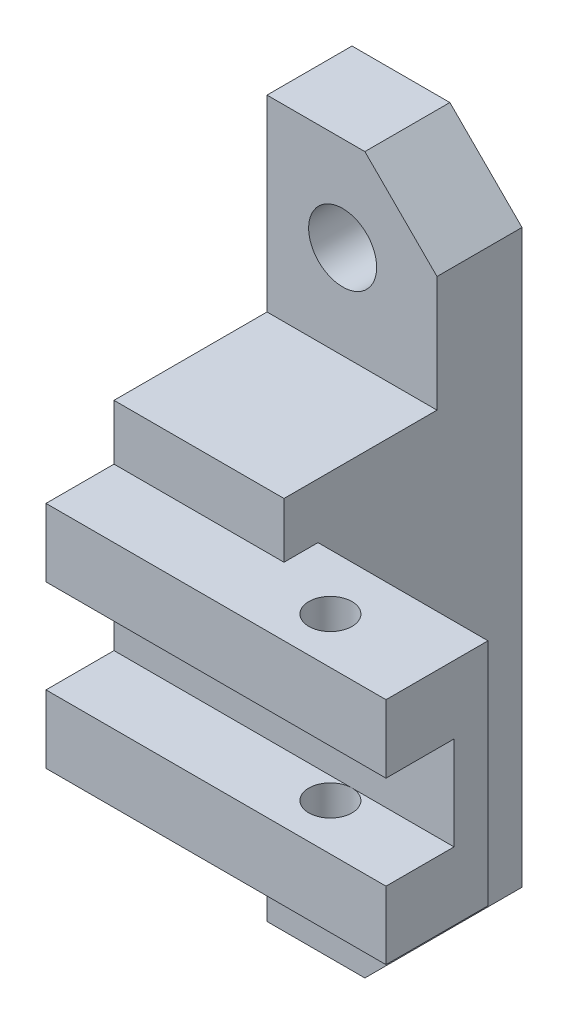
ISO-10303-21;
HEADER;
FILE_DESCRIPTION(('STEP AP214'),'2;1');
FILE_NAME('part.step','',(''),(''),'','','');
FILE_SCHEMA(('AUTOMOTIVE_DESIGN { 1 0 10303 214 1 1 1 1 }'));
ENDSEC;
DATA;
#1=APPLICATION_CONTEXT('core data for automotive mechanical design processes');
#2=APPLICATION_PROTOCOL_DEFINITION('international standard','automotive_design',2000,#1);
#3=PRODUCT_CONTEXT('',#1,'mechanical');
#4=PRODUCT('Part','Part','',(#3));
#5=PRODUCT_RELATED_PRODUCT_CATEGORY('part','',(#4));
#6=PRODUCT_DEFINITION_FORMATION('','',#4);
#7=PRODUCT_DEFINITION_CONTEXT('part definition',#1,'design');
#8=PRODUCT_DEFINITION('design','',#6,#7);
#9=PRODUCT_DEFINITION_SHAPE('','',#8);
#10=(LENGTH_UNIT() NAMED_UNIT(*) SI_UNIT(.MILLI.,.METRE.));
#11=(NAMED_UNIT(*) PLANE_ANGLE_UNIT() SI_UNIT($,.RADIAN.));
#12=(NAMED_UNIT(*) SI_UNIT($,.STERADIAN.) SOLID_ANGLE_UNIT());
#13=UNCERTAINTY_MEASURE_WITH_UNIT(LENGTH_MEASURE(1.E-05),#10,'distance_accuracy_value','');
#14=(GEOMETRIC_REPRESENTATION_CONTEXT(3) GLOBAL_UNCERTAINTY_ASSIGNED_CONTEXT((#13)) GLOBAL_UNIT_ASSIGNED_CONTEXT((#10,
#11,#12)) REPRESENTATION_CONTEXT('',''));
#15=CARTESIAN_POINT('',(0.,0.,0.));
#16=DIRECTION('',(0.,0.,1.));
#17=DIRECTION('',(1.,0.,0.));
#18=AXIS2_PLACEMENT_3D('',#15,#16,#17);
#19=CARTESIAN_POINT('',(21.05,0.,5.));
#20=DIRECTION('',(1.,0.,0.));
#21=DIRECTION('',(0.,1.,0.));
#22=AXIS2_PLACEMENT_3D('',#19,#20,#21);
#23=PLANE('',#22);
#24=DIRECTION('',(0.,1.,0.));
#25=VECTOR('',#24,1.);
#26=CARTESIAN_POINT('',(21.05,-6.75,12.));
#27=LINE('',#26,#25);
#28=CARTESIAN_POINT('',(21.05,-6.75,12.));
#29=VERTEX_POINT('',#28);
#30=CARTESIAN_POINT('',(21.05,6.75,12.));
#31=VERTEX_POINT('',#30);
#32=EDGE_CURVE('E199',#29,#31,#27,.T.);
#33=ORIENTED_EDGE('',*,*,#32,.F.);
#34=DIRECTION('',(0.,0.,1.));
#35=VECTOR('',#34,1.);
#36=CARTESIAN_POINT('',(21.05,-6.75,12.));
#37=LINE('',#36,#35);
#38=CARTESIAN_POINT('',(21.05,-6.75,14.));
#39=VERTEX_POINT('',#38);
#40=EDGE_CURVE('E196',#29,#39,#37,.T.);
#41=ORIENTED_EDGE('',*,*,#40,.T.);
#42=DIRECTION('',(0.,1.,0.));
#43=VECTOR('',#42,1.);
#44=CARTESIAN_POINT('',(21.05,10.,14.));
#45=LINE('',#44,#43);
#46=CARTESIAN_POINT('',(21.05,-10.,14.));
#47=VERTEX_POINT('',#46);
#48=EDGE_CURVE('E280',#47,#39,#45,.T.);
#49=ORIENTED_EDGE('',*,*,#48,.F.);
#50=DIRECTION('',(0.,0.,-1.));
#51=VECTOR('',#50,1.);
#52=CARTESIAN_POINT('',(21.05,-10.,46.3606797749979));
#53=LINE('',#52,#51);
#54=CARTESIAN_POINT('',(21.05,-10.,5.));
#55=VERTEX_POINT('',#54);
#56=EDGE_CURVE('E261',#47,#55,#53,.T.);
#57=ORIENTED_EDGE('',*,*,#56,.T.);
#58=DIRECTION('',(0.,-1.,0.));
#59=VECTOR('',#58,1.);
#60=CARTESIAN_POINT('',(21.05,0.,5.));
#61=LINE('',#60,#59);
#62=CARTESIAN_POINT('',(21.05,-16.8073593128807,5.));
#63=VERTEX_POINT('',#62);
#64=EDGE_CURVE('E301',#55,#63,#61,.T.);
#65=ORIENTED_EDGE('',*,*,#64,.T.);
#66=DIRECTION('',(0.,0.,-1.));
#67=VECTOR('',#66,1.);
#68=CARTESIAN_POINT('',(21.05,-16.8073593128807,5.));
#69=LINE('',#68,#67);
#70=CARTESIAN_POINT('',(21.05,-16.8073593128807,0.));
#71=VERTEX_POINT('',#70);
#72=EDGE_CURVE('E319',#63,#71,#69,.T.);
#73=ORIENTED_EDGE('',*,*,#72,.T.);
#74=DIRECTION('',(0.,-1.,0.));
#75=VECTOR('',#74,1.);
#76=CARTESIAN_POINT('',(21.05,0.,0.));
#77=LINE('',#76,#75);
#78=CARTESIAN_POINT('',(21.05,16.8073593128807,0.));
#79=VERTEX_POINT('',#78);
#80=EDGE_CURVE('E325',#79,#71,#77,.T.);
#81=ORIENTED_EDGE('',*,*,#80,.F.);
#82=DIRECTION('',(0.,0.,-1.));
#83=VECTOR('',#82,1.);
#84=CARTESIAN_POINT('',(21.05,16.8073593128807,5.));
#85=LINE('',#84,#83);
#86=CARTESIAN_POINT('',(21.05,16.8073593128807,5.));
#87=VERTEX_POINT('',#86);
#88=EDGE_CURVE('E251',#87,#79,#85,.T.);
#89=ORIENTED_EDGE('',*,*,#88,.F.);
#90=CARTESIAN_POINT('',(21.05,10.,5.));
#91=VERTEX_POINT('',#90);
#92=EDGE_CURVE('E302',#87,#91,#61,.T.);
#93=ORIENTED_EDGE('',*,*,#92,.T.);
#94=DIRECTION('',(0.,0.,-1.));
#95=VECTOR('',#94,1.);
#96=CARTESIAN_POINT('',(21.05,10.,46.3606797749979));
#97=LINE('',#96,#95);
#98=CARTESIAN_POINT('',(21.05,10.,14.));
#99=VERTEX_POINT('',#98);
#100=EDGE_CURVE('E271',#99,#91,#97,.T.);
#101=ORIENTED_EDGE('',*,*,#100,.F.);
#102=CARTESIAN_POINT('',(21.05,6.75,14.));
#103=VERTEX_POINT('',#102);
#104=EDGE_CURVE('E283',#103,#99,#45,.T.);
#105=ORIENTED_EDGE('',*,*,#104,.F.);
#106=DIRECTION('',(0.,0.,1.));
#107=VECTOR('',#106,1.);
#108=CARTESIAN_POINT('',(21.05,6.75,12.));
#109=LINE('',#108,#107);
#110=EDGE_CURVE('E214',#31,#103,#109,.T.);
#111=ORIENTED_EDGE('',*,*,#110,.F.);
#112=EDGE_LOOP('',(#33,#41,#49,#57,#65,#73,#81,#89,#93,#101,#105,#111));
#113=FACE_BOUND('',#112,.T.);
#114=ADVANCED_FACE('F37',(#113),#23,.T.);
#115=CARTESIAN_POINT('',(0.,0.,14.));
#116=DIRECTION('',(0.,0.,1.));
#117=DIRECTION('',(1.,0.,0.));
#118=AXIS2_PLACEMENT_3D('',#115,#116,#117);
#119=PLANE('',#118);
#120=ORIENTED_EDGE('',*,*,#48,.T.);
#121=DIRECTION('',(1.,0.,0.));
#122=VECTOR('',#121,1.);
#123=CARTESIAN_POINT('',(11.05,-6.75,14.));
#124=LINE('',#123,#122);
#125=CARTESIAN_POINT('',(11.05,-6.75,14.));
#126=VERTEX_POINT('',#125);
#127=EDGE_CURVE('E218',#126,#39,#124,.T.);
#128=ORIENTED_EDGE('',*,*,#127,.F.);
#129=DIRECTION('',(0.,-1.,0.));
#130=VECTOR('',#129,1.);
#131=CARTESIAN_POINT('',(11.05,10.,14.));
#132=LINE('',#131,#130);
#133=CARTESIAN_POINT('',(11.05,-10.,14.));
#134=VERTEX_POINT('',#133);
#135=EDGE_CURVE('E276',#126,#134,#132,.T.);
#136=ORIENTED_EDGE('',*,*,#135,.T.);
#137=DIRECTION('',(1.,0.,0.));
#138=VECTOR('',#137,1.);
#139=CARTESIAN_POINT('',(11.05,-10.,14.));
#140=LINE('',#139,#138);
#141=EDGE_CURVE('E265',#134,#47,#140,.T.);
#142=ORIENTED_EDGE('',*,*,#141,.T.);
#143=EDGE_LOOP('',(#120,#128,#136,#142));
#144=FACE_BOUND('',#143,.T.);
#145=ADVANCED_FACE('F421',(#144),#119,.T.);
#146=DIRECTION('',(1.,0.,0.));
#147=VECTOR('',#146,1.);
#148=CARTESIAN_POINT('',(0.,-2.75,14.));
#149=LINE('',#148,#147);
#150=CARTESIAN_POINT('',(11.05,-2.75,14.));
#151=VERTEX_POINT('',#150);
#152=CARTESIAN_POINT('',(25.05,-2.75,14.));
#153=VERTEX_POINT('',#152);
#154=EDGE_CURVE('E12',#151,#153,#149,.T.);
#155=ORIENTED_EDGE('',*,*,#154,.T.);
#156=CARTESIAN_POINT('',(31.05,-2.75,14.));
#157=VERTEX_POINT('',#156);
#158=EDGE_CURVE('E46',#153,#157,#149,.T.);
#159=ORIENTED_EDGE('',*,*,#158,.T.);
#160=DIRECTION('',(0.,-1.,0.));
#161=VECTOR('',#160,1.);
#162=CARTESIAN_POINT('',(31.05,-6.75,14.));
#163=LINE('',#162,#161);
#164=CARTESIAN_POINT('',(31.05,2.75,14.));
#165=VERTEX_POINT('',#164);
#166=EDGE_CURVE('E205',#165,#157,#163,.T.);
#167=ORIENTED_EDGE('',*,*,#166,.F.);
#168=DIRECTION('',(1.,0.,0.));
#169=VECTOR('',#168,1.);
#170=CARTESIAN_POINT('',(11.05,2.75,14.));
#171=LINE('',#170,#169);
#172=CARTESIAN_POINT('',(25.05,2.75,14.));
#173=VERTEX_POINT('',#172);
#174=EDGE_CURVE('E234',#173,#165,#171,.T.);
#175=ORIENTED_EDGE('',*,*,#174,.F.);
#176=CARTESIAN_POINT('',(11.05,2.75,14.));
#177=VERTEX_POINT('',#176);
#178=EDGE_CURVE('E239',#177,#173,#171,.T.);
#179=ORIENTED_EDGE('',*,*,#178,.F.);
#180=EDGE_CURVE('E275',#177,#151,#132,.T.);
#181=ORIENTED_EDGE('',*,*,#180,.T.);
#182=EDGE_LOOP('',(#155,#159,#167,#175,#179,#181));
#183=FACE_BOUND('',#182,.T.);
#184=ADVANCED_FACE('F408',(#183),#119,.T.);
#185=DIRECTION('',(-1.,0.,0.));
#186=VECTOR('',#185,1.);
#187=CARTESIAN_POINT('',(11.05,6.75,14.));
#188=LINE('',#187,#186);
#189=CARTESIAN_POINT('',(11.05,6.75,14.));
#190=VERTEX_POINT('',#189);
#191=EDGE_CURVE('E248',#103,#190,#188,.T.);
#192=ORIENTED_EDGE('',*,*,#191,.F.);
#193=ORIENTED_EDGE('',*,*,#104,.T.);
#194=DIRECTION('',(-1.,0.,0.));
#195=VECTOR('',#194,1.);
#196=CARTESIAN_POINT('',(11.05,10.,14.));
#197=LINE('',#196,#195);
#198=CARTESIAN_POINT('',(11.05,10.,14.));
#199=VERTEX_POINT('',#198);
#200=EDGE_CURVE('E277',#99,#199,#197,.T.);
#201=ORIENTED_EDGE('',*,*,#200,.T.);
#202=EDGE_CURVE('E272',#199,#190,#132,.T.);
#203=ORIENTED_EDGE('',*,*,#202,.T.);
#204=EDGE_LOOP('',(#192,#193,#201,#203));
#205=FACE_BOUND('',#204,.T.);
#206=ADVANCED_FACE('F391',(#205),#119,.T.);
#207=CARTESIAN_POINT('',(0.,0.,5.));
#208=DIRECTION('',(0.,0.,1.));
#209=DIRECTION('',(1.,0.,0.));
#210=AXIS2_PLACEMENT_3D('',#207,#208,#209);
#211=PLANE('',#210);
#212=DIRECTION('',(1.,0.,0.));
#213=VECTOR('',#212,1.);
#214=CARTESIAN_POINT('',(11.05,-10.,5.));
#215=LINE('',#214,#213);
#216=CARTESIAN_POINT('',(11.05,-10.,5.));
#217=VERTEX_POINT('',#216);
#218=EDGE_CURVE('E262',#217,#55,#215,.T.);
#219=ORIENTED_EDGE('',*,*,#218,.F.);
#220=DIRECTION('',(0.,-1.,0.));
#221=VECTOR('',#220,1.);
#222=CARTESIAN_POINT('',(11.05,0.,5.));
#223=LINE('',#222,#221);
#224=CARTESIAN_POINT('',(11.05,-21.05,5.));
#225=VERTEX_POINT('',#224);
#226=EDGE_CURVE('E310',#217,#225,#223,.T.);
#227=ORIENTED_EDGE('',*,*,#226,.T.);
#228=DIRECTION('',(1.,0.,0.));
#229=VECTOR('',#228,1.);
#230=CARTESIAN_POINT('',(0.,-21.05,5.));
#231=LINE('',#230,#229);
#232=CARTESIAN_POINT('',(16.8073593128807,-21.05,5.));
#233=VERTEX_POINT('',#232);
#234=EDGE_CURVE('E313',#225,#233,#231,.T.);
#235=ORIENTED_EDGE('',*,*,#234,.T.);
#236=DIRECTION('',(0.707106781186547,0.707106781186548,0.));
#237=VECTOR('',#236,1.);
#238=CARTESIAN_POINT('',(18.9286796564404,-18.9286796564403,5.));
#239=LINE('',#238,#237);
#240=EDGE_CURVE('E316',#233,#63,#239,.T.);
#241=ORIENTED_EDGE('',*,*,#240,.T.);
#242=ORIENTED_EDGE('',*,*,#64,.F.);
#243=EDGE_LOOP('',(#219,#227,#235,#241,#242));
#244=FACE_BOUND('',#243,.T.);
#245=CARTESIAN_POINT('',(15.5,-15.5,5.));
#246=DIRECTION('',(0.,0.,1.));
#247=DIRECTION('',(1.,0.,0.));
#248=AXIS2_PLACEMENT_3D('',#245,#246,#247);
#249=CIRCLE('',#248,2.);
#250=CARTESIAN_POINT('',(17.5,-15.5,5.));
#251=VERTEX_POINT('',#250);
#252=EDGE_CURVE('E294',#251,#251,#249,.T.);
#253=ORIENTED_EDGE('',*,*,#252,.F.);
#254=EDGE_LOOP('',(#253));
#255=FACE_BOUND('',#254,.T.);
#256=ADVANCED_FACE('F475',(#244,#255),#211,.T.);
#257=CARTESIAN_POINT('',(18.9286796564404,18.9286796564403,5.));
#258=DIRECTION('',(-0.707106781186548,-0.707106781186547,0.));
#259=DIRECTION('',(0.707106781186547,-0.707106781186548,0.));
#260=AXIS2_PLACEMENT_3D('',#257,#258,#259);
#261=PLANE('',#260);
#262=DIRECTION('',(-0.707106781186547,0.707106781186548,0.));
#263=VECTOR('',#262,1.);
#264=CARTESIAN_POINT('',(18.9286796564404,18.9286796564403,0.));
#265=LINE('',#264,#263);
#266=CARTESIAN_POINT('',(16.8073593128807,21.05,0.));
#267=VERTEX_POINT('',#266);
#268=EDGE_CURVE('E328',#79,#267,#265,.T.);
#269=ORIENTED_EDGE('',*,*,#268,.T.);
#270=DIRECTION('',(0.,0.,-1.));
#271=VECTOR('',#270,1.);
#272=CARTESIAN_POINT('',(16.8073593128807,21.05,5.));
#273=LINE('',#272,#271);
#274=CARTESIAN_POINT('',(16.8073593128807,21.05,5.));
#275=VERTEX_POINT('',#274);
#276=EDGE_CURVE('E351',#275,#267,#273,.T.);
#277=ORIENTED_EDGE('',*,*,#276,.F.);
#278=DIRECTION('',(-0.707106781186547,0.707106781186548,0.));
#279=VECTOR('',#278,1.);
#280=CARTESIAN_POINT('',(18.9286796564404,18.9286796564403,5.));
#281=LINE('',#280,#279);
#282=EDGE_CURVE('E305',#87,#275,#281,.T.);
#283=ORIENTED_EDGE('',*,*,#282,.F.);
#284=ORIENTED_EDGE('',*,*,#88,.T.);
#285=EDGE_LOOP('',(#269,#277,#283,#284));
#286=FACE_BOUND('',#285,.T.);
#287=ADVANCED_FACE('F356',(#286),#261,.F.);
#288=CARTESIAN_POINT('',(0.,21.05,5.));
#289=DIRECTION('',(0.,1.,0.));
#290=DIRECTION('',(0.,0.,1.));
#291=AXIS2_PLACEMENT_3D('',#288,#289,#290);
#292=PLANE('',#291);
#293=DIRECTION('',(1.,0.,0.));
#294=VECTOR('',#293,1.);
#295=CARTESIAN_POINT('',(0.,21.05,0.));
#296=LINE('',#295,#294);
#297=CARTESIAN_POINT('',(11.05,21.05,0.));
#298=VERTEX_POINT('',#297);
#299=EDGE_CURVE('E331',#298,#267,#296,.T.);
#300=ORIENTED_EDGE('',*,*,#299,.F.);
#301=DIRECTION('',(0.,0.,-1.));
#302=VECTOR('',#301,1.);
#303=CARTESIAN_POINT('',(11.05,21.05,5.));
#304=LINE('',#303,#302);
#305=CARTESIAN_POINT('',(11.05,21.05,5.));
#306=VERTEX_POINT('',#305);
#307=EDGE_CURVE('E349',#306,#298,#304,.T.);
#308=ORIENTED_EDGE('',*,*,#307,.F.);
#309=DIRECTION('',(1.,0.,0.));
#310=VECTOR('',#309,1.);
#311=CARTESIAN_POINT('',(0.,21.05,5.));
#312=LINE('',#311,#310);
#313=EDGE_CURVE('E307',#306,#275,#312,.T.);
#314=ORIENTED_EDGE('',*,*,#313,.T.);
#315=ORIENTED_EDGE('',*,*,#276,.T.);
#316=EDGE_LOOP('',(#300,#308,#314,#315));
#317=FACE_BOUND('',#316,.T.);
#318=ADVANCED_FACE('F379',(#317),#292,.T.);
#319=CARTESIAN_POINT('',(11.05,0.,5.));
#320=DIRECTION('',(1.,0.,0.));
#321=DIRECTION('',(0.,1.,0.));
#322=AXIS2_PLACEMENT_3D('',#319,#320,#321);
#323=PLANE('',#322);
#324=DIRECTION('',(0.,-1.,0.));
#325=VECTOR('',#324,1.);
#326=CARTESIAN_POINT('',(11.05,0.,0.));
#327=LINE('',#326,#325);
#328=CARTESIAN_POINT('',(11.05,-21.05,0.));
#329=VERTEX_POINT('',#328);
#330=EDGE_CURVE('E334',#298,#329,#327,.T.);
#331=ORIENTED_EDGE('',*,*,#330,.T.);
#332=DIRECTION('',(0.,0.,-1.));
#333=VECTOR('',#332,1.);
#334=CARTESIAN_POINT('',(11.05,-21.05,5.));
#335=LINE('',#334,#333);
#336=EDGE_CURVE('E346',#225,#329,#335,.T.);
#337=ORIENTED_EDGE('',*,*,#336,.F.);
#338=ORIENTED_EDGE('',*,*,#226,.F.);
#339=DIRECTION('',(0.,0.,-1.));
#340=VECTOR('',#339,1.);
#341=CARTESIAN_POINT('',(11.05,-10.,46.3606797749979));
#342=LINE('',#341,#340);
#343=EDGE_CURVE('E266',#134,#217,#342,.T.);
#344=ORIENTED_EDGE('',*,*,#343,.F.);
#345=ORIENTED_EDGE('',*,*,#135,.F.);
#346=DIRECTION('',(0.,0.,-1.));
#347=VECTOR('',#346,1.);
#348=CARTESIAN_POINT('',(11.05,-6.75,18.));
#349=LINE('',#348,#347);
#350=CARTESIAN_POINT('',(11.05,-6.75,18.));
#351=VERTEX_POINT('',#350);
#352=EDGE_CURVE('E189',#351,#126,#349,.T.);
#353=ORIENTED_EDGE('',*,*,#352,.F.);
#354=DIRECTION('',(0.,-1.,0.));
#355=VECTOR('',#354,1.);
#356=CARTESIAN_POINT('',(11.05,-2.75,18.));
#357=LINE('',#356,#355);
#358=CARTESIAN_POINT('',(11.05,-2.75,18.));
#359=VERTEX_POINT('',#358);
#360=EDGE_CURVE('E219',#359,#351,#357,.T.);
#361=ORIENTED_EDGE('',*,*,#360,.F.);
#362=DIRECTION('',(0.,0.,-1.));
#363=VECTOR('',#362,1.);
#364=CARTESIAN_POINT('',(11.05,-2.75,18.));
#365=LINE('',#364,#363);
#366=EDGE_CURVE('E227',#359,#151,#365,.T.);
#367=ORIENTED_EDGE('',*,*,#366,.T.);
#368=ORIENTED_EDGE('',*,*,#180,.F.);
#369=DIRECTION('',(0.,0.,-1.));
#370=VECTOR('',#369,1.);
#371=CARTESIAN_POINT('',(11.05,2.75,18.));
#372=LINE('',#371,#370);
#373=CARTESIAN_POINT('',(11.05,2.75,18.));
#374=VERTEX_POINT('',#373);
#375=EDGE_CURVE('E258',#374,#177,#372,.T.);
#376=ORIENTED_EDGE('',*,*,#375,.F.);
#377=DIRECTION('',(0.,-1.,0.));
#378=VECTOR('',#377,1.);
#379=CARTESIAN_POINT('',(11.05,2.75,18.));
#380=LINE('',#379,#378);
#381=CARTESIAN_POINT('',(11.05,6.75,18.));
#382=VERTEX_POINT('',#381);
#383=EDGE_CURVE('E235',#382,#374,#380,.T.);
#384=ORIENTED_EDGE('',*,*,#383,.F.);
#385=DIRECTION('',(0.,0.,-1.));
#386=VECTOR('',#385,1.);
#387=CARTESIAN_POINT('',(11.05,6.75,18.));
#388=LINE('',#387,#386);
#389=EDGE_CURVE('E245',#382,#190,#388,.T.);
#390=ORIENTED_EDGE('',*,*,#389,.T.);
#391=ORIENTED_EDGE('',*,*,#202,.F.);
#392=DIRECTION('',(0.,0.,-1.));
#393=VECTOR('',#392,1.);
#394=CARTESIAN_POINT('',(11.05,10.,46.3606797749979));
#395=LINE('',#394,#393);
#396=CARTESIAN_POINT('',(11.05,10.,5.));
#397=VERTEX_POINT('',#396);
#398=EDGE_CURVE('E270',#199,#397,#395,.T.);
#399=ORIENTED_EDGE('',*,*,#398,.T.);
#400=EDGE_CURVE('E311',#306,#397,#223,.T.);
#401=ORIENTED_EDGE('',*,*,#400,.F.);
#402=ORIENTED_EDGE('',*,*,#307,.T.);
#403=EDGE_LOOP('',(#331,#337,#338,#344,#345,#353,#361,#367,#368,#376,#384,#390,#391,#399,#401,#402));
#404=FACE_BOUND('',#403,.T.);
#405=ADVANCED_FACE('F375',(#404),#323,.F.);
#406=CARTESIAN_POINT('',(0.,-21.05,5.));
#407=DIRECTION('',(0.,1.,0.));
#408=DIRECTION('',(0.,0.,1.));
#409=AXIS2_PLACEMENT_3D('',#406,#407,#408);
#410=PLANE('',#409);
#411=DIRECTION('',(1.,0.,0.));
#412=VECTOR('',#411,1.);
#413=CARTESIAN_POINT('',(0.,-21.05,0.));
#414=LINE('',#413,#412);
#415=CARTESIAN_POINT('',(16.8073593128807,-21.05,0.));
#416=VERTEX_POINT('',#415);
#417=EDGE_CURVE('E337',#329,#416,#414,.T.);
#418=ORIENTED_EDGE('',*,*,#417,.T.);
#419=DIRECTION('',(0.,0.,-1.));
#420=VECTOR('',#419,1.);
#421=CARTESIAN_POINT('',(16.8073593128807,-21.05,5.));
#422=LINE('',#421,#420);
#423=EDGE_CURVE('E343',#233,#416,#422,.T.);
#424=ORIENTED_EDGE('',*,*,#423,.F.);
#425=ORIENTED_EDGE('',*,*,#234,.F.);
#426=ORIENTED_EDGE('',*,*,#336,.T.);
#427=EDGE_LOOP('',(#418,#424,#425,#426));
#428=FACE_BOUND('',#427,.T.);
#429=ADVANCED_FACE('F372',(#428),#410,.F.);
#430=CARTESIAN_POINT('',(15.5,15.5,5.));
#431=DIRECTION('',(0.,0.,-1.));
#432=DIRECTION('',(-1.,0.,0.));
#433=AXIS2_PLACEMENT_3D('',#430,#431,#432);
#434=CYLINDRICAL_SURFACE('',#433,2.);
#435=CARTESIAN_POINT('',(15.5,15.5,5.));
#436=DIRECTION('',(0.,0.,1.));
#437=DIRECTION('',(1.,0.,0.));
#438=AXIS2_PLACEMENT_3D('',#435,#436,#437);
#439=CIRCLE('',#438,2.);
#440=CARTESIAN_POINT('',(17.5,15.5,5.));
#441=VERTEX_POINT('',#440);
#442=EDGE_CURVE('E297',#441,#441,#439,.T.);
#443=ORIENTED_EDGE('',*,*,#442,.T.);
#444=EDGE_LOOP('',(#443));
#445=FACE_BOUND('',#444,.T.);
#446=CARTESIAN_POINT('',(15.5,15.5,0.));
#447=DIRECTION('',(0.,0.,1.));
#448=DIRECTION('',(1.,0.,0.));
#449=AXIS2_PLACEMENT_3D('',#446,#447,#448);
#450=CIRCLE('',#449,2.);
#451=CARTESIAN_POINT('',(17.5,15.5,0.));
#452=VERTEX_POINT('',#451);
#453=EDGE_CURVE('E322',#452,#452,#450,.T.);
#454=ORIENTED_EDGE('',*,*,#453,.F.);
#455=EDGE_LOOP('',(#454));
#456=FACE_BOUND('',#455,.T.);
#457=ADVANCED_FACE('F452',(#445,#456),#434,.F.);
#458=CARTESIAN_POINT('',(15.5,-15.5,5.));
#459=DIRECTION('',(0.,0.,-1.));
#460=DIRECTION('',(-1.,0.,0.));
#461=AXIS2_PLACEMENT_3D('',#458,#459,#460);
#462=CYLINDRICAL_SURFACE('',#461,2.);
#463=ORIENTED_EDGE('',*,*,#252,.T.);
#464=EDGE_LOOP('',(#463));
#465=FACE_BOUND('',#464,.T.);
#466=CARTESIAN_POINT('',(15.5,-15.5,0.));
#467=DIRECTION('',(0.,0.,1.));
#468=DIRECTION('',(1.,0.,0.));
#469=AXIS2_PLACEMENT_3D('',#466,#467,#468);
#470=CIRCLE('',#469,2.);
#471=CARTESIAN_POINT('',(17.5,-15.5,0.));
#472=VERTEX_POINT('',#471);
#473=EDGE_CURVE('E274',#472,#472,#470,.T.);
#474=ORIENTED_EDGE('',*,*,#473,.F.);
#475=EDGE_LOOP('',(#474));
#476=FACE_BOUND('',#475,.T.);
#477=ADVANCED_FACE('F39',(#465,#476),#462,.F.);
#478=CARTESIAN_POINT('',(18.9286796564404,-18.9286796564403,5.));
#479=DIRECTION('',(-0.707106781186548,0.707106781186547,0.));
#480=DIRECTION('',(-0.707106781186547,-0.707106781186548,0.));
#481=AXIS2_PLACEMENT_3D('',#478,#479,#480);
#482=PLANE('',#481);
#483=DIRECTION('',(0.707106781186547,0.707106781186548,0.));
#484=VECTOR('',#483,1.);
#485=CARTESIAN_POINT('',(18.9286796564404,-18.9286796564403,0.));
#486=LINE('',#485,#484);
#487=EDGE_CURVE('E298',#416,#71,#486,.T.);
#488=ORIENTED_EDGE('',*,*,#487,.T.);
#489=ORIENTED_EDGE('',*,*,#72,.F.);
#490=ORIENTED_EDGE('',*,*,#240,.F.);
#491=ORIENTED_EDGE('',*,*,#423,.T.);
#492=EDGE_LOOP('',(#488,#489,#490,#491));
#493=FACE_BOUND('',#492,.T.);
#494=ADVANCED_FACE('F367',(#493),#482,.F.);
#495=DIRECTION('',(-1.,0.,0.));
#496=VECTOR('',#495,1.);
#497=CARTESIAN_POINT('',(11.05,10.,5.));
#498=LINE('',#497,#496);
#499=EDGE_CURVE('E267',#91,#397,#498,.T.);
#500=ORIENTED_EDGE('',*,*,#499,.F.);
#501=ORIENTED_EDGE('',*,*,#92,.F.);
#502=ORIENTED_EDGE('',*,*,#282,.T.);
#503=ORIENTED_EDGE('',*,*,#313,.F.);
#504=ORIENTED_EDGE('',*,*,#400,.T.);
#505=EDGE_LOOP('',(#500,#501,#502,#503,#504));
#506=FACE_BOUND('',#505,.T.);
#507=ORIENTED_EDGE('',*,*,#442,.F.);
#508=EDGE_LOOP('',(#507));
#509=FACE_BOUND('',#508,.T.);
#510=ADVANCED_FACE('F381',(#506,#509),#211,.T.);
#511=CARTESIAN_POINT('',(0.,0.,0.));
#512=DIRECTION('',(0.,0.,1.));
#513=DIRECTION('',(1.,0.,0.));
#514=AXIS2_PLACEMENT_3D('',#511,#512,#513);
#515=PLANE('',#514);
#516=ORIENTED_EDGE('',*,*,#473,.T.);
#517=EDGE_LOOP('',(#516));
#518=FACE_BOUND('',#517,.T.);
#519=ORIENTED_EDGE('',*,*,#453,.T.);
#520=EDGE_LOOP('',(#519));
#521=FACE_BOUND('',#520,.T.);
#522=ORIENTED_EDGE('',*,*,#80,.T.);
#523=ORIENTED_EDGE('',*,*,#487,.F.);
#524=ORIENTED_EDGE('',*,*,#417,.F.);
#525=ORIENTED_EDGE('',*,*,#330,.F.);
#526=ORIENTED_EDGE('',*,*,#299,.T.);
#527=ORIENTED_EDGE('',*,*,#268,.F.);
#528=EDGE_LOOP('',(#522,#523,#524,#525,#526,#527));
#529=FACE_BOUND('',#528,.T.);
#530=ADVANCED_FACE('F362',(#518,#521,#529),#515,.F.);
#531=CARTESIAN_POINT('',(11.05,10.,46.3606797749979));
#532=DIRECTION('',(0.,-1.,0.));
#533=DIRECTION('',(0.,0.,-1.));
#534=AXIS2_PLACEMENT_3D('',#531,#532,#533);
#535=PLANE('',#534);
#536=ORIENTED_EDGE('',*,*,#200,.F.);
#537=ORIENTED_EDGE('',*,*,#100,.T.);
#538=ORIENTED_EDGE('',*,*,#499,.T.);
#539=ORIENTED_EDGE('',*,*,#398,.F.);
#540=EDGE_LOOP('',(#536,#537,#538,#539));
#541=FACE_BOUND('',#540,.T.);
#542=ADVANCED_FACE('F387',(#541),#535,.F.);
#543=CARTESIAN_POINT('',(11.05,-10.,46.3606797749979));
#544=DIRECTION('',(0.,1.,0.));
#545=DIRECTION('',(0.,0.,1.));
#546=AXIS2_PLACEMENT_3D('',#543,#544,#545);
#547=PLANE('',#546);
#548=ORIENTED_EDGE('',*,*,#141,.F.);
#549=ORIENTED_EDGE('',*,*,#343,.T.);
#550=ORIENTED_EDGE('',*,*,#218,.T.);
#551=ORIENTED_EDGE('',*,*,#56,.F.);
#552=EDGE_LOOP('',(#548,#549,#550,#551));
#553=FACE_BOUND('',#552,.T.);
#554=ADVANCED_FACE('F472',(#553),#547,.F.);
#555=CARTESIAN_POINT('',(11.05,2.75,18.));
#556=DIRECTION('',(0.,1.,0.));
#557=DIRECTION('',(0.,0.,1.));
#558=AXIS2_PLACEMENT_3D('',#555,#556,#557);
#559=PLANE('',#558);
#560=ORIENTED_EDGE('',*,*,#178,.T.);
#561=CARTESIAN_POINT('',(25.05,2.75,15.27));
#562=DIRECTION('',(0.,1.,0.));
#563=DIRECTION('',(0.,0.,1.));
#564=AXIS2_PLACEMENT_3D('',#561,#562,#563);
#565=CIRCLE('',#564,1.27);
#566=EDGE_CURVE('E51',#173,#173,#565,.T.);
#567=ORIENTED_EDGE('',*,*,#566,.T.);
#568=ORIENTED_EDGE('',*,*,#174,.T.);
#569=DIRECTION('',(0.,0.,-1.));
#570=VECTOR('',#569,1.);
#571=CARTESIAN_POINT('',(31.05,2.75,18.));
#572=LINE('',#571,#570);
#573=CARTESIAN_POINT('',(31.05,2.75,18.));
#574=VERTEX_POINT('',#573);
#575=EDGE_CURVE('E256',#574,#165,#572,.T.);
#576=ORIENTED_EDGE('',*,*,#575,.F.);
#577=DIRECTION('',(1.,0.,0.));
#578=VECTOR('',#577,1.);
#579=CARTESIAN_POINT('',(11.05,2.75,18.));
#580=LINE('',#579,#578);
#581=EDGE_CURVE('E238',#374,#574,#580,.T.);
#582=ORIENTED_EDGE('',*,*,#581,.F.);
#583=ORIENTED_EDGE('',*,*,#375,.T.);
#584=EDGE_LOOP('',(#560,#567,#568,#576,#582,#583));
#585=FACE_BOUND('',#584,.T.);
#586=ADVANCED_FACE('F404',(#585),#559,.F.);
#587=CARTESIAN_POINT('',(31.05,2.75,18.));
#588=DIRECTION('',(-1.,0.,0.));
#589=DIRECTION('',(0.,0.,1.));
#590=AXIS2_PLACEMENT_3D('',#587,#588,#589);
#591=PLANE('',#590);
#592=ORIENTED_EDGE('',*,*,#575,.T.);
#593=ORIENTED_EDGE('',*,*,#166,.T.);
#594=DIRECTION('',(0.,0.,-1.));
#595=VECTOR('',#594,1.);
#596=CARTESIAN_POINT('',(31.05,-2.75,18.));
#597=LINE('',#596,#595);
#598=CARTESIAN_POINT('',(31.05,-2.75,18.));
#599=VERTEX_POINT('',#598);
#600=EDGE_CURVE('E190',#599,#157,#597,.T.);
#601=ORIENTED_EDGE('',*,*,#600,.F.);
#602=DIRECTION('',(0.,1.,0.));
#603=VECTOR('',#602,1.);
#604=CARTESIAN_POINT('',(31.05,-2.75,18.));
#605=LINE('',#604,#603);
#606=CARTESIAN_POINT('',(31.05,-6.75,18.));
#607=VERTEX_POINT('',#606);
#608=EDGE_CURVE('E187',#607,#599,#605,.T.);
#609=ORIENTED_EDGE('',*,*,#608,.F.);
#610=DIRECTION('',(0.,0.,-1.));
#611=VECTOR('',#610,1.);
#612=CARTESIAN_POINT('',(31.05,-6.75,18.));
#613=LINE('',#612,#611);
#614=CARTESIAN_POINT('',(31.05,-6.75,12.));
#615=VERTEX_POINT('',#614);
#616=EDGE_CURVE('E179',#607,#615,#613,.T.);
#617=ORIENTED_EDGE('',*,*,#616,.T.);
#618=DIRECTION('',(0.,-1.,0.));
#619=VECTOR('',#618,1.);
#620=CARTESIAN_POINT('',(31.05,-6.75,12.));
#621=LINE('',#620,#619);
#622=CARTESIAN_POINT('',(31.05,6.75,12.));
#623=VERTEX_POINT('',#622);
#624=EDGE_CURVE('E185',#623,#615,#621,.T.);
#625=ORIENTED_EDGE('',*,*,#624,.F.);
#626=DIRECTION('',(0.,0.,-1.));
#627=VECTOR('',#626,1.);
#628=CARTESIAN_POINT('',(31.05,6.75,18.));
#629=LINE('',#628,#627);
#630=CARTESIAN_POINT('',(31.05,6.75,18.));
#631=VERTEX_POINT('',#630);
#632=EDGE_CURVE('E254',#631,#623,#629,.T.);
#633=ORIENTED_EDGE('',*,*,#632,.F.);
#634=DIRECTION('',(0.,1.,0.));
#635=VECTOR('',#634,1.);
#636=CARTESIAN_POINT('',(31.05,2.75,18.));
#637=LINE('',#636,#635);
#638=EDGE_CURVE('E241',#574,#631,#637,.T.);
#639=ORIENTED_EDGE('',*,*,#638,.F.);
#640=EDGE_LOOP('',(#592,#593,#601,#609,#617,#625,#633,#639));
#641=FACE_BOUND('',#640,.T.);
#642=ADVANCED_FACE('F182',(#641),#591,.F.);
#643=CARTESIAN_POINT('',(11.05,6.75,18.));
#644=DIRECTION('',(0.,-1.,0.));
#645=DIRECTION('',(0.,0.,-1.));
#646=AXIS2_PLACEMENT_3D('',#643,#644,#645);
#647=PLANE('',#646);
#648=CARTESIAN_POINT('',(25.05,6.75,15.27));
#649=DIRECTION('',(0.,-1.,0.));
#650=DIRECTION('',(0.,0.,-1.));
#651=AXIS2_PLACEMENT_3D('',#648,#649,#650);
#652=CIRCLE('',#651,1.27);
#653=CARTESIAN_POINT('',(25.05,6.75,14.));
#654=VERTEX_POINT('',#653);
#655=EDGE_CURVE('E208',#654,#654,#652,.T.);
#656=ORIENTED_EDGE('',*,*,#655,.T.);
#657=EDGE_LOOP('',(#656));
#658=FACE_BOUND('',#657,.T.);
#659=ORIENTED_EDGE('',*,*,#632,.T.);
#660=DIRECTION('',(1.,0.,0.));
#661=VECTOR('',#660,1.);
#662=CARTESIAN_POINT('',(31.05,6.75,12.));
#663=LINE('',#662,#661);
#664=EDGE_CURVE('E204',#31,#623,#663,.T.);
#665=ORIENTED_EDGE('',*,*,#664,.F.);
#666=ORIENTED_EDGE('',*,*,#110,.T.);
#667=ORIENTED_EDGE('',*,*,#191,.T.);
#668=ORIENTED_EDGE('',*,*,#389,.F.);
#669=DIRECTION('',(-1.,0.,0.));
#670=VECTOR('',#669,1.);
#671=CARTESIAN_POINT('',(11.05,6.75,18.));
#672=LINE('',#671,#670);
#673=EDGE_CURVE('E243',#631,#382,#672,.T.);
#674=ORIENTED_EDGE('',*,*,#673,.F.);
#675=EDGE_LOOP('',(#659,#665,#666,#667,#668,#674));
#676=FACE_BOUND('',#675,.T.);
#677=ADVANCED_FACE('F394',(#658,#676),#647,.F.);
#678=CARTESIAN_POINT('',(0.,0.,18.));
#679=DIRECTION('',(0.,0.,-1.));
#680=DIRECTION('',(-1.,0.,0.));
#681=AXIS2_PLACEMENT_3D('',#678,#679,#680);
#682=PLANE('',#681);
#683=ORIENTED_EDGE('',*,*,#383,.T.);
#684=ORIENTED_EDGE('',*,*,#581,.T.);
#685=ORIENTED_EDGE('',*,*,#638,.T.);
#686=ORIENTED_EDGE('',*,*,#673,.T.);
#687=EDGE_LOOP('',(#683,#684,#685,#686));
#688=FACE_BOUND('',#687,.T.);
#689=ADVANCED_FACE('F400',(#688),#682,.F.);
#690=CARTESIAN_POINT('',(11.05,-6.75,18.));
#691=DIRECTION('',(0.,1.,0.));
#692=DIRECTION('',(0.,0.,1.));
#693=AXIS2_PLACEMENT_3D('',#690,#691,#692);
#694=PLANE('',#693);
#695=CARTESIAN_POINT('',(25.05,-6.75,15.27));
#696=DIRECTION('',(0.,1.,0.));
#697=DIRECTION('',(0.,0.,1.));
#698=AXIS2_PLACEMENT_3D('',#695,#696,#697);
#699=CIRCLE('',#698,1.27);
#700=CARTESIAN_POINT('',(25.05,-6.75,16.54));
#701=VERTEX_POINT('',#700);
#702=EDGE_CURVE('E427',#701,#701,#699,.T.);
#703=ORIENTED_EDGE('',*,*,#702,.T.);
#704=EDGE_LOOP('',(#703));
#705=FACE_BOUND('',#704,.T.);
#706=ORIENTED_EDGE('',*,*,#127,.T.);
#707=ORIENTED_EDGE('',*,*,#40,.F.);
#708=DIRECTION('',(-1.,0.,0.));
#709=VECTOR('',#708,1.);
#710=CARTESIAN_POINT('',(31.05,-6.75,12.));
#711=LINE('',#710,#709);
#712=EDGE_CURVE('E193',#615,#29,#711,.T.);
#713=ORIENTED_EDGE('',*,*,#712,.F.);
#714=ORIENTED_EDGE('',*,*,#616,.F.);
#715=DIRECTION('',(1.,0.,0.));
#716=VECTOR('',#715,1.);
#717=CARTESIAN_POINT('',(11.05,-6.75,18.));
#718=LINE('',#717,#716);
#719=EDGE_CURVE('E222',#351,#607,#718,.T.);
#720=ORIENTED_EDGE('',*,*,#719,.F.);
#721=ORIENTED_EDGE('',*,*,#352,.T.);
#722=EDGE_LOOP('',(#706,#707,#713,#714,#720,#721));
#723=FACE_BOUND('',#722,.T.);
#724=ADVANCED_FACE('F195',(#705,#723),#694,.F.);
#725=CARTESIAN_POINT('',(11.05,-2.75,18.));
#726=DIRECTION('',(0.,-1.,0.));
#727=DIRECTION('',(0.,0.,-1.));
#728=AXIS2_PLACEMENT_3D('',#725,#726,#727);
#729=PLANE('',#728);
#730=ORIENTED_EDGE('',*,*,#158,.F.);
#731=CARTESIAN_POINT('',(25.05,-2.75,15.27));
#732=DIRECTION('',(0.,-1.,0.));
#733=DIRECTION('',(0.,0.,-1.));
#734=AXIS2_PLACEMENT_3D('',#731,#732,#733);
#735=CIRCLE('',#734,1.27);
#736=EDGE_CURVE('E41',#153,#153,#735,.T.);
#737=ORIENTED_EDGE('',*,*,#736,.T.);
#738=ORIENTED_EDGE('',*,*,#154,.F.);
#739=ORIENTED_EDGE('',*,*,#366,.F.);
#740=DIRECTION('',(-1.,0.,0.));
#741=VECTOR('',#740,1.);
#742=CARTESIAN_POINT('',(11.05,-2.75,18.));
#743=LINE('',#742,#741);
#744=EDGE_CURVE('E225',#599,#359,#743,.T.);
#745=ORIENTED_EDGE('',*,*,#744,.F.);
#746=ORIENTED_EDGE('',*,*,#600,.T.);
#747=EDGE_LOOP('',(#730,#737,#738,#739,#745,#746));
#748=FACE_BOUND('',#747,.T.);
#749=ADVANCED_FACE('F412',(#748),#729,.F.);
#750=CARTESIAN_POINT('',(0.,0.,18.));
#751=DIRECTION('',(0.,0.,1.));
#752=DIRECTION('',(1.,0.,0.));
#753=AXIS2_PLACEMENT_3D('',#750,#751,#752);
#754=PLANE('',#753);
#755=ORIENTED_EDGE('',*,*,#360,.T.);
#756=ORIENTED_EDGE('',*,*,#719,.T.);
#757=ORIENTED_EDGE('',*,*,#608,.T.);
#758=ORIENTED_EDGE('',*,*,#744,.T.);
#759=EDGE_LOOP('',(#755,#756,#757,#758));
#760=FACE_BOUND('',#759,.T.);
#761=ADVANCED_FACE('F416',(#760),#754,.T.);
#762=CARTESIAN_POINT('',(0.,0.,12.));
#763=DIRECTION('',(0.,0.,1.));
#764=DIRECTION('',(1.,0.,0.));
#765=AXIS2_PLACEMENT_3D('',#762,#763,#764);
#766=PLANE('',#765);
#767=ORIENTED_EDGE('',*,*,#624,.T.);
#768=ORIENTED_EDGE('',*,*,#712,.T.);
#769=ORIENTED_EDGE('',*,*,#32,.T.);
#770=ORIENTED_EDGE('',*,*,#664,.T.);
#771=EDGE_LOOP('',(#767,#768,#769,#770));
#772=FACE_BOUND('',#771,.T.);
#773=ADVANCED_FACE('F202',(#772),#766,.F.);
#774=CARTESIAN_POINT('',(25.05,21.05,15.27));
#775=DIRECTION('',(0.,-1.,0.));
#776=DIRECTION('',(0.,0.,-1.));
#777=AXIS2_PLACEMENT_3D('',#774,#775,#776);
#778=CYLINDRICAL_SURFACE('',#777,1.27);
#779=ORIENTED_EDGE('',*,*,#736,.F.);
#780=EDGE_LOOP('',(#779));
#781=FACE_BOUND('',#780,.T.);
#782=ORIENTED_EDGE('',*,*,#702,.F.);
#783=EDGE_LOOP('',(#782));
#784=FACE_BOUND('',#783,.T.);
#785=ADVANCED_FACE('F438',(#781,#784),#778,.F.);
#786=ORIENTED_EDGE('',*,*,#566,.F.);
#787=EDGE_LOOP('',(#786));
#788=FACE_BOUND('',#787,.T.);
#789=ORIENTED_EDGE('',*,*,#655,.F.);
#790=EDGE_LOOP('',(#789));
#791=FACE_BOUND('',#790,.T.);
#792=ADVANCED_FACE('F436',(#788,#791),#778,.F.);
#793=CLOSED_SHELL('',(#114,#145,#184,#206,#256,#287,#318,#405,#429,#457,#477,#494,#510,#530,
#542,#554,#586,#642,#677,#689,#724,#749,#761,#773,#785,#792));
#794=MANIFOLD_SOLID_BREP('B2',#793);
#795=ADVANCED_BREP_SHAPE_REPRESENTATION('',(#18,#794),#14);
#796=SHAPE_DEFINITION_REPRESENTATION(#9,#795);
ENDSEC;
END-ISO-10303-21;
